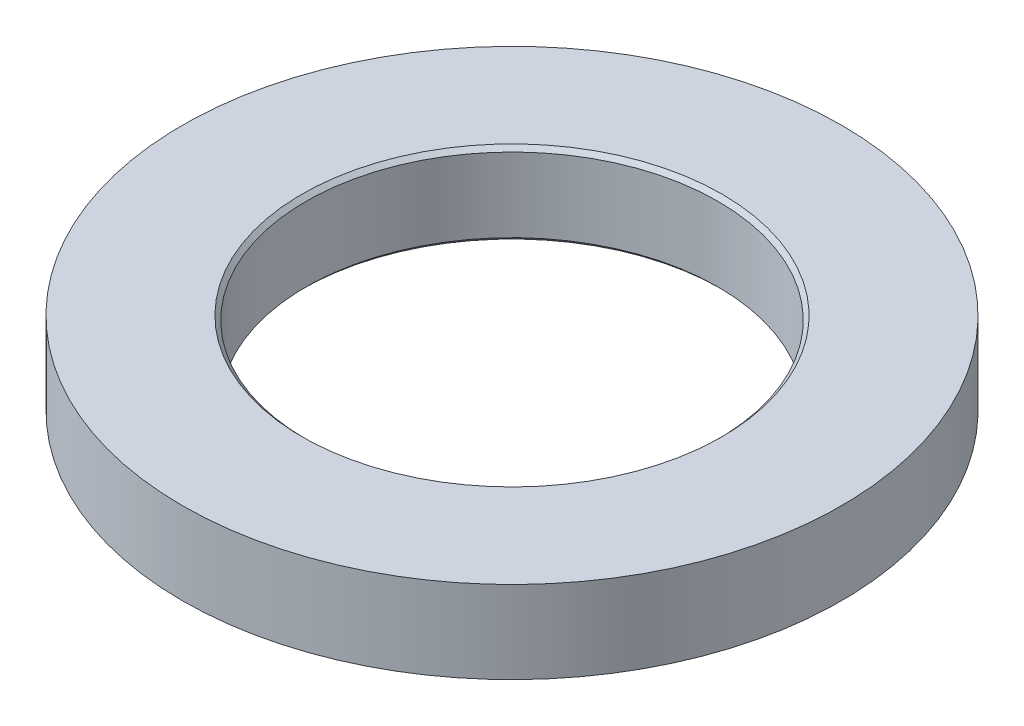
ISO-10303-21;
HEADER;
FILE_DESCRIPTION(('STEP AP214'),'2;1');
FILE_NAME('part.step','',(''),(''),'','','');
FILE_SCHEMA(('AUTOMOTIVE_DESIGN { 1 0 10303 214 1 1 1 1 }'));
ENDSEC;
DATA;
#1=APPLICATION_CONTEXT('core data for automotive mechanical design processes');
#2=APPLICATION_PROTOCOL_DEFINITION('international standard','automotive_design',2000,#1);
#3=PRODUCT_CONTEXT('',#1,'mechanical');
#4=PRODUCT('Part','Part','',(#3));
#5=PRODUCT_RELATED_PRODUCT_CATEGORY('part','',(#4));
#6=PRODUCT_DEFINITION_FORMATION('','',#4);
#7=PRODUCT_DEFINITION_CONTEXT('part definition',#1,'design');
#8=PRODUCT_DEFINITION('design','',#6,#7);
#9=PRODUCT_DEFINITION_SHAPE('','',#8);
#10=(LENGTH_UNIT() NAMED_UNIT(*) SI_UNIT(.MILLI.,.METRE.));
#11=(NAMED_UNIT(*) PLANE_ANGLE_UNIT() SI_UNIT($,.RADIAN.));
#12=(NAMED_UNIT(*) SI_UNIT($,.STERADIAN.) SOLID_ANGLE_UNIT());
#13=UNCERTAINTY_MEASURE_WITH_UNIT(LENGTH_MEASURE(1.E-05),#10,'distance_accuracy_value','');
#14=(GEOMETRIC_REPRESENTATION_CONTEXT(3) GLOBAL_UNCERTAINTY_ASSIGNED_CONTEXT((#13)) GLOBAL_UNIT_ASSIGNED_CONTEXT((#10,
#11,#12)) REPRESENTATION_CONTEXT('',''));
#15=CARTESIAN_POINT('',(0.,0.,0.));
#16=DIRECTION('',(0.,0.,1.));
#17=DIRECTION('',(1.,0.,0.));
#18=AXIS2_PLACEMENT_3D('',#15,#16,#17);
#19=CARTESIAN_POINT('',(0.,-2.,0.));
#20=DIRECTION('',(0.,-1.,0.));
#21=DIRECTION('',(0.,0.,-1.));
#22=AXIS2_PLACEMENT_3D('',#19,#20,#21);
#23=PLANE('',#22);
#24=CARTESIAN_POINT('',(0.,-2.,0.));
#25=DIRECTION('',(0.,-1.,0.));
#26=DIRECTION('',(0.,0.,-1.));
#27=AXIS2_PLACEMENT_3D('',#24,#25,#26);
#28=CIRCLE('',#27,5.09999999999999);
#29=CARTESIAN_POINT('',(0.,-2.,-5.09999999999999));
#30=VERTEX_POINT('',#29);
#31=EDGE_CURVE('E51',#30,#30,#28,.F.);
#32=ORIENTED_EDGE('',*,*,#31,.T.);
#33=EDGE_LOOP('',(#32));
#34=FACE_BOUND('',#33,.T.);
#35=CARTESIAN_POINT('',(0.,-2.,0.));
#36=DIRECTION('',(0.,-1.,0.));
#37=DIRECTION('',(0.,0.,-1.));
#38=AXIS2_PLACEMENT_3D('',#35,#36,#37);
#39=CIRCLE('',#38,8.);
#40=CARTESIAN_POINT('',(0.,-2.,-8.));
#41=VERTEX_POINT('',#40);
#42=EDGE_CURVE('E61',#41,#41,#39,.T.);
#43=ORIENTED_EDGE('',*,*,#42,.T.);
#44=EDGE_LOOP('',(#43));
#45=FACE_BOUND('',#44,.T.);
#46=ADVANCED_FACE('F43',(#34,#45),#23,.T.);
#47=CARTESIAN_POINT('',(0.,0.,0.));
#48=DIRECTION('',(0.,-1.,0.));
#49=DIRECTION('',(0.,0.,-1.));
#50=AXIS2_PLACEMENT_3D('',#47,#48,#49);
#51=PLANE('',#50);
#52=CARTESIAN_POINT('',(0.,0.,0.));
#53=DIRECTION('',(0.,-1.,0.));
#54=DIRECTION('',(0.,0.,-1.));
#55=AXIS2_PLACEMENT_3D('',#52,#53,#54);
#56=CIRCLE('',#55,5.09999999999999);
#57=CARTESIAN_POINT('',(0.,0.,-5.09999999999999));
#58=VERTEX_POINT('',#57);
#59=EDGE_CURVE('E10',#58,#58,#56,.T.);
#60=ORIENTED_EDGE('',*,*,#59,.T.);
#61=EDGE_LOOP('',(#60));
#62=FACE_BOUND('',#61,.T.);
#63=CARTESIAN_POINT('',(0.,0.,0.));
#64=DIRECTION('',(0.,-1.,0.));
#65=DIRECTION('',(0.,0.,-1.));
#66=AXIS2_PLACEMENT_3D('',#63,#64,#65);
#67=CIRCLE('',#66,8.);
#68=CARTESIAN_POINT('',(0.,0.,-8.));
#69=VERTEX_POINT('',#68);
#70=EDGE_CURVE('E63',#69,#69,#67,.T.);
#71=ORIENTED_EDGE('',*,*,#70,.F.);
#72=EDGE_LOOP('',(#71));
#73=FACE_BOUND('',#72,.T.);
#74=ADVANCED_FACE('F78',(#62,#73),#51,.F.);
#75=CARTESIAN_POINT('',(0.,-2.,0.));
#76=DIRECTION('',(0.,1.,0.));
#77=DIRECTION('',(0.,0.,1.));
#78=AXIS2_PLACEMENT_3D('',#75,#76,#77);
#79=CYLINDRICAL_SURFACE('',#78,8.);
#80=ORIENTED_EDGE('',*,*,#42,.F.);
#81=EDGE_LOOP('',(#80));
#82=FACE_BOUND('',#81,.T.);
#83=ORIENTED_EDGE('',*,*,#70,.T.);
#84=EDGE_LOOP('',(#83));
#85=FACE_BOUND('',#84,.T.);
#86=ADVANCED_FACE('F74',(#82,#85),#79,.T.);
#87=CARTESIAN_POINT('',(0.,-2.,0.));
#88=DIRECTION('',(0.,1.,0.));
#89=DIRECTION('',(0.,0.,1.));
#90=AXIS2_PLACEMENT_3D('',#87,#88,#89);
#91=CYLINDRICAL_SURFACE('',#90,4.99999999999999);
#92=CARTESIAN_POINT('',(0.,-1.9,0.));
#93=DIRECTION('',(0.,-1.,0.));
#94=DIRECTION('',(0.,0.,-1.));
#95=AXIS2_PLACEMENT_3D('',#92,#93,#94);
#96=CIRCLE('',#95,4.99999999999999);
#97=CARTESIAN_POINT('',(0.,-1.9,-4.99999999999999));
#98=VERTEX_POINT('',#97);
#99=EDGE_CURVE('E54',#98,#98,#96,.T.);
#100=ORIENTED_EDGE('',*,*,#99,.T.);
#101=EDGE_LOOP('',(#100));
#102=FACE_BOUND('',#101,.T.);
#103=CARTESIAN_POINT('',(0.,-0.1,0.));
#104=DIRECTION('',(0.,-1.,0.));
#105=DIRECTION('',(0.,0.,-1.));
#106=AXIS2_PLACEMENT_3D('',#103,#104,#105);
#107=CIRCLE('',#106,4.99999999999999);
#108=CARTESIAN_POINT('',(0.,-0.1,-4.99999999999999));
#109=VERTEX_POINT('',#108);
#110=EDGE_CURVE('E56',#109,#109,#107,.F.);
#111=ORIENTED_EDGE('',*,*,#110,.T.);
#112=EDGE_LOOP('',(#111));
#113=FACE_BOUND('',#112,.T.);
#114=ADVANCED_FACE('F73',(#102,#113),#91,.F.);
#115=CARTESIAN_POINT('',(0.,-1.9,0.));
#116=DIRECTION('',(0.,-1.,0.));
#117=DIRECTION('',(0.,0.,-1.));
#118=AXIS2_PLACEMENT_3D('',#115,#116,#117);
#119=CONICAL_SURFACE('',#118,4.99999999999999,0.785398163397448);
#120=ORIENTED_EDGE('',*,*,#31,.F.);
#121=EDGE_LOOP('',(#120));
#122=FACE_BOUND('',#121,.T.);
#123=ORIENTED_EDGE('',*,*,#99,.F.);
#124=EDGE_LOOP('',(#123));
#125=FACE_BOUND('',#124,.T.);
#126=ADVANCED_FACE('F87',(#122,#125),#119,.F.);
#127=CARTESIAN_POINT('',(0.,0.,0.));
#128=DIRECTION('',(0.,1.,0.));
#129=DIRECTION('',(0.,0.,1.));
#130=AXIS2_PLACEMENT_3D('',#127,#128,#129);
#131=CONICAL_SURFACE('',#130,5.09999999999999,0.785398163397444);
#132=ORIENTED_EDGE('',*,*,#110,.F.);
#133=EDGE_LOOP('',(#132));
#134=FACE_BOUND('',#133,.T.);
#135=ORIENTED_EDGE('',*,*,#59,.F.);
#136=EDGE_LOOP('',(#135));
#137=FACE_BOUND('',#136,.T.);
#138=ADVANCED_FACE('F46',(#134,#137),#131,.F.);
#139=CLOSED_SHELL('',(#46,#74,#86,#114,#126,#138));
#140=MANIFOLD_SOLID_BREP('B2',#139);
#141=ADVANCED_BREP_SHAPE_REPRESENTATION('',(#18,#140),#14);
#142=SHAPE_DEFINITION_REPRESENTATION(#9,#141);
ENDSEC;
END-ISO-10303-21;
